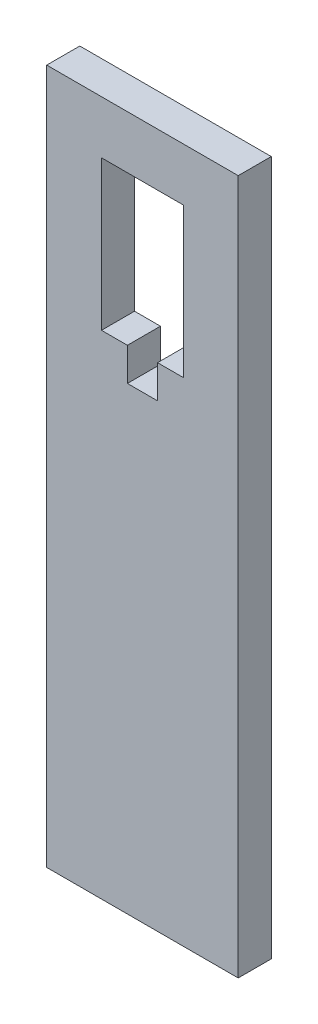
ISO-10303-21;
HEADER;
FILE_DESCRIPTION(('STEP AP214'),'2;1');
FILE_NAME('part.step','',(''),(''),'','','');
FILE_SCHEMA(('AUTOMOTIVE_DESIGN { 1 0 10303 214 1 1 1 1 }'));
ENDSEC;
DATA;
#1=APPLICATION_CONTEXT('core data for automotive mechanical design processes');
#2=APPLICATION_PROTOCOL_DEFINITION('international standard','automotive_design',2000,#1);
#3=PRODUCT_CONTEXT('',#1,'mechanical');
#4=PRODUCT('Part','Part','',(#3));
#5=PRODUCT_RELATED_PRODUCT_CATEGORY('part','',(#4));
#6=PRODUCT_DEFINITION_FORMATION('','',#4);
#7=PRODUCT_DEFINITION_CONTEXT('part definition',#1,'design');
#8=PRODUCT_DEFINITION('design','',#6,#7);
#9=PRODUCT_DEFINITION_SHAPE('','',#8);
#10=(LENGTH_UNIT() NAMED_UNIT(*) SI_UNIT(.MILLI.,.METRE.));
#11=(NAMED_UNIT(*) PLANE_ANGLE_UNIT() SI_UNIT($,.RADIAN.));
#12=(NAMED_UNIT(*) SI_UNIT($,.STERADIAN.) SOLID_ANGLE_UNIT());
#13=UNCERTAINTY_MEASURE_WITH_UNIT(LENGTH_MEASURE(1.E-05),#10,'distance_accuracy_value','');
#14=(GEOMETRIC_REPRESENTATION_CONTEXT(3) GLOBAL_UNCERTAINTY_ASSIGNED_CONTEXT((#13)) GLOBAL_UNIT_ASSIGNED_CONTEXT((#10,
#11,#12)) REPRESENTATION_CONTEXT('',''));
#15=CARTESIAN_POINT('',(0.,0.,0.));
#16=DIRECTION('',(0.,0.,1.));
#17=DIRECTION('',(1.,0.,0.));
#18=AXIS2_PLACEMENT_3D('',#15,#16,#17);
#19=CARTESIAN_POINT('',(-18.5582300884956,31.0897345132743,5.));
#20=DIRECTION('',(0.,-1.,0.));
#21=DIRECTION('',(0.,0.,-1.));
#22=AXIS2_PLACEMENT_3D('',#19,#20,#21);
#23=PLANE('',#22);
#24=DIRECTION('',(-1.,0.,0.));
#25=VECTOR('',#24,1.);
#26=CARTESIAN_POINT('',(-18.5582300884956,31.0897345132743,5.));
#27=LINE('',#26,#25);
#28=CARTESIAN_POINT('',(-6.35823008849556,31.0897345132743,5.));
#29=VERTEX_POINT('',#28);
#30=CARTESIAN_POINT('',(-10.2782300884956,31.0897345132743,5.));
#31=VERTEX_POINT('',#30);
#32=EDGE_CURVE('E241',#29,#31,#27,.T.);
#33=ORIENTED_EDGE('',*,*,#32,.F.);
#34=DIRECTION('',(0.,0.,1.));
#35=VECTOR('',#34,1.);
#36=CARTESIAN_POINT('',(-6.35823008849556,31.0897345132743,0.));
#37=LINE('',#36,#35);
#38=CARTESIAN_POINT('',(-6.35823008849556,31.0897345132743,0.));
#39=VERTEX_POINT('',#38);
#40=EDGE_CURVE('E136',#39,#29,#37,.T.);
#41=ORIENTED_EDGE('',*,*,#40,.F.);
#42=DIRECTION('',(-1.,0.,0.));
#43=VECTOR('',#42,1.);
#44=CARTESIAN_POINT('',(-18.5582300884956,31.0897345132743,0.));
#45=LINE('',#44,#43);
#46=CARTESIAN_POINT('',(-10.2782300884956,31.0897345132743,0.));
#47=VERTEX_POINT('',#46);
#48=EDGE_CURVE('E253',#39,#47,#45,.T.);
#49=ORIENTED_EDGE('',*,*,#48,.T.);
#50=DIRECTION('',(0.,0.,-1.));
#51=VECTOR('',#50,1.);
#52=CARTESIAN_POINT('',(-10.2782300884956,31.0897345132743,0.));
#53=LINE('',#52,#51);
#54=EDGE_CURVE('E213',#31,#47,#53,.T.);
#55=ORIENTED_EDGE('',*,*,#54,.F.);
#56=EDGE_LOOP('',(#33,#41,#49,#55));
#57=FACE_BOUND('',#56,.T.);
#58=ADVANCED_FACE('F39',(#57),#23,.F.);
#59=CARTESIAN_POINT('',(2.12176991150444,31.0897345132743,0.));
#60=VERTEX_POINT('',#59);
#61=CARTESIAN_POINT('',(-1.79823008849555,31.0897345132743,0.));
#62=VERTEX_POINT('',#61);
#63=EDGE_CURVE('E235',#60,#62,#45,.T.);
#64=ORIENTED_EDGE('',*,*,#63,.T.);
#65=DIRECTION('',(0.,0.,-1.));
#66=VECTOR('',#65,1.);
#67=CARTESIAN_POINT('',(-1.79823008849555,31.0897345132743,0.));
#68=LINE('',#67,#66);
#69=CARTESIAN_POINT('',(-1.79823008849555,31.0897345132743,5.));
#70=VERTEX_POINT('',#69);
#71=EDGE_CURVE('E150',#70,#62,#68,.T.);
#72=ORIENTED_EDGE('',*,*,#71,.F.);
#73=CARTESIAN_POINT('',(2.12176991150444,31.0897345132743,5.));
#74=VERTEX_POINT('',#73);
#75=EDGE_CURVE('E63',#74,#70,#27,.T.);
#76=ORIENTED_EDGE('',*,*,#75,.F.);
#77=DIRECTION('',(0.,0.,1.));
#78=VECTOR('',#77,1.);
#79=CARTESIAN_POINT('',(2.12176991150444,31.0897345132743,0.));
#80=LINE('',#79,#78);
#81=EDGE_CURVE('E192',#60,#74,#80,.T.);
#82=ORIENTED_EDGE('',*,*,#81,.F.);
#83=EDGE_LOOP('',(#64,#72,#76,#82));
#84=FACE_BOUND('',#83,.T.);
#85=ADVANCED_FACE('F281',(#84),#23,.F.);
#86=CARTESIAN_POINT('',(-18.5582300884956,31.0897345132743,5.));
#87=DIRECTION('',(1.,0.,0.));
#88=DIRECTION('',(0.,1.,0.));
#89=AXIS2_PLACEMENT_3D('',#86,#87,#88);
#90=PLANE('',#89);
#91=DIRECTION('',(0.,-1.,0.));
#92=VECTOR('',#91,1.);
#93=CARTESIAN_POINT('',(-18.5582300884956,31.0897345132743,0.));
#94=LINE('',#93,#92);
#95=CARTESIAN_POINT('',(-18.5582300884956,61.6897345132743,0.));
#96=VERTEX_POINT('',#95);
#97=CARTESIAN_POINT('',(-18.5582300884955,-43.4102654867257,0.));
#98=VERTEX_POINT('',#97);
#99=EDGE_CURVE('E229',#96,#98,#94,.T.);
#100=ORIENTED_EDGE('',*,*,#99,.T.);
#101=DIRECTION('',(0.,0.,-1.));
#102=VECTOR('',#101,1.);
#103=CARTESIAN_POINT('',(-18.5582300884955,-43.4102654867257,5.));
#104=LINE('',#103,#102);
#105=CARTESIAN_POINT('',(-18.5582300884955,-43.4102654867257,5.));
#106=VERTEX_POINT('',#105);
#107=EDGE_CURVE('E11',#106,#98,#104,.T.);
#108=ORIENTED_EDGE('',*,*,#107,.F.);
#109=DIRECTION('',(0.,-1.,0.));
#110=VECTOR('',#109,1.);
#111=CARTESIAN_POINT('',(-18.5582300884956,31.0897345132743,5.));
#112=LINE('',#111,#110);
#113=CARTESIAN_POINT('',(-18.5582300884956,61.6897345132743,5.));
#114=VERTEX_POINT('',#113);
#115=EDGE_CURVE('E230',#114,#106,#112,.T.);
#116=ORIENTED_EDGE('',*,*,#115,.F.);
#117=DIRECTION('',(0.,0.,1.));
#118=VECTOR('',#117,1.);
#119=CARTESIAN_POINT('',(-18.5582300884956,61.6897345132743,0.));
#120=LINE('',#119,#118);
#121=EDGE_CURVE('E175',#96,#114,#120,.T.);
#122=ORIENTED_EDGE('',*,*,#121,.F.);
#123=EDGE_LOOP('',(#100,#108,#116,#122));
#124=FACE_BOUND('',#123,.T.);
#125=ADVANCED_FACE('F41',(#124),#90,.F.);
#126=CARTESIAN_POINT('',(-18.5582300884955,-43.4102654867257,5.));
#127=DIRECTION('',(0.,1.,0.));
#128=DIRECTION('',(0.,0.,1.));
#129=AXIS2_PLACEMENT_3D('',#126,#127,#128);
#130=PLANE('',#129);
#131=DIRECTION('',(1.,0.,0.));
#132=VECTOR('',#131,1.);
#133=CARTESIAN_POINT('',(-18.5582300884955,-43.4102654867257,0.));
#134=LINE('',#133,#132);
#135=CARTESIAN_POINT('',(10.4017699115045,-43.4102654867257,0.));
#136=VERTEX_POINT('',#135);
#137=EDGE_CURVE('E247',#98,#136,#134,.T.);
#138=ORIENTED_EDGE('',*,*,#137,.T.);
#139=DIRECTION('',(0.,0.,-1.));
#140=VECTOR('',#139,1.);
#141=CARTESIAN_POINT('',(10.4017699115045,-43.4102654867257,5.));
#142=LINE('',#141,#140);
#143=CARTESIAN_POINT('',(10.4017699115045,-43.4102654867257,5.));
#144=VERTEX_POINT('',#143);
#145=EDGE_CURVE('E48',#144,#136,#142,.T.);
#146=ORIENTED_EDGE('',*,*,#145,.F.);
#147=DIRECTION('',(1.,0.,0.));
#148=VECTOR('',#147,1.);
#149=CARTESIAN_POINT('',(-18.5582300884955,-43.4102654867257,5.));
#150=LINE('',#149,#148);
#151=EDGE_CURVE('E234',#106,#144,#150,.T.);
#152=ORIENTED_EDGE('',*,*,#151,.F.);
#153=ORIENTED_EDGE('',*,*,#107,.T.);
#154=EDGE_LOOP('',(#138,#146,#152,#153));
#155=FACE_BOUND('',#154,.T.);
#156=ADVANCED_FACE('F274',(#155),#130,.F.);
#157=CARTESIAN_POINT('',(10.4017699115044,31.0897345132743,5.));
#158=DIRECTION('',(-1.,0.,0.));
#159=DIRECTION('',(0.,-1.,0.));
#160=AXIS2_PLACEMENT_3D('',#157,#158,#159);
#161=PLANE('',#160);
#162=DIRECTION('',(0.,1.,0.));
#163=VECTOR('',#162,1.);
#164=CARTESIAN_POINT('',(10.4017699115044,31.0897345132743,0.));
#165=LINE('',#164,#163);
#166=CARTESIAN_POINT('',(10.4017699115044,61.6897345132743,0.));
#167=VERTEX_POINT('',#166);
#168=EDGE_CURVE('E250',#136,#167,#165,.T.);
#169=ORIENTED_EDGE('',*,*,#168,.T.);
#170=DIRECTION('',(0.,0.,-1.));
#171=VECTOR('',#170,1.);
#172=CARTESIAN_POINT('',(10.4017699115044,61.6897345132743,0.));
#173=LINE('',#172,#171);
#174=CARTESIAN_POINT('',(10.4017699115044,61.6897345132743,5.));
#175=VERTEX_POINT('',#174);
#176=EDGE_CURVE('E184',#175,#167,#173,.T.);
#177=ORIENTED_EDGE('',*,*,#176,.F.);
#178=DIRECTION('',(0.,1.,0.));
#179=VECTOR('',#178,1.);
#180=CARTESIAN_POINT('',(10.4017699115044,31.0897345132743,5.));
#181=LINE('',#180,#179);
#182=EDGE_CURVE('E238',#144,#175,#181,.T.);
#183=ORIENTED_EDGE('',*,*,#182,.F.);
#184=ORIENTED_EDGE('',*,*,#145,.T.);
#185=EDGE_LOOP('',(#169,#177,#183,#184));
#186=FACE_BOUND('',#185,.T.);
#187=ADVANCED_FACE('F262',(#186),#161,.F.);
#188=CARTESIAN_POINT('',(0.,0.,5.));
#189=DIRECTION('',(0.,0.,1.));
#190=DIRECTION('',(1.,0.,0.));
#191=AXIS2_PLACEMENT_3D('',#188,#189,#190);
#192=PLANE('',#191);
#193=DIRECTION('',(0.,1.,0.));
#194=VECTOR('',#193,1.);
#195=CARTESIAN_POINT('',(-6.35823008849556,26.0897345132743,5.));
#196=LINE('',#195,#194);
#197=CARTESIAN_POINT('',(-6.35823008849556,26.0897345132743,5.));
#198=VERTEX_POINT('',#197);
#199=EDGE_CURVE('E131',#198,#29,#196,.T.);
#200=ORIENTED_EDGE('',*,*,#199,.T.);
#201=ORIENTED_EDGE('',*,*,#32,.T.);
#202=DIRECTION('',(0.,-1.,0.));
#203=VECTOR('',#202,1.);
#204=CARTESIAN_POINT('',(-10.2782300884956,53.6897345132743,5.));
#205=LINE('',#204,#203);
#206=CARTESIAN_POINT('',(-10.2782300884956,53.6897345132743,5.));
#207=VERTEX_POINT('',#206);
#208=EDGE_CURVE('E225',#207,#31,#205,.T.);
#209=ORIENTED_EDGE('',*,*,#208,.F.);
#210=DIRECTION('',(1.,0.,0.));
#211=VECTOR('',#210,1.);
#212=CARTESIAN_POINT('',(-18.5582300884956,53.6897345132743,5.));
#213=LINE('',#212,#211);
#214=CARTESIAN_POINT('',(2.12176991150444,53.6897345132743,5.));
#215=VERTEX_POINT('',#214);
#216=EDGE_CURVE('E168',#207,#215,#213,.T.);
#217=ORIENTED_EDGE('',*,*,#216,.T.);
#218=DIRECTION('',(0.,-1.,0.));
#219=VECTOR('',#218,1.);
#220=CARTESIAN_POINT('',(2.12176991150444,53.6897345132743,5.));
#221=LINE('',#220,#219);
#222=EDGE_CURVE('E203',#215,#74,#221,.T.);
#223=ORIENTED_EDGE('',*,*,#222,.T.);
#224=ORIENTED_EDGE('',*,*,#75,.T.);
#225=DIRECTION('',(0.,1.,0.));
#226=VECTOR('',#225,1.);
#227=CARTESIAN_POINT('',(-1.79823008849555,26.0897345132743,5.));
#228=LINE('',#227,#226);
#229=CARTESIAN_POINT('',(-1.79823008849555,26.0897345132743,5.));
#230=VERTEX_POINT('',#229);
#231=EDGE_CURVE('E141',#230,#70,#228,.T.);
#232=ORIENTED_EDGE('',*,*,#231,.F.);
#233=DIRECTION('',(1.,0.,0.));
#234=VECTOR('',#233,1.);
#235=CARTESIAN_POINT('',(-6.35823008849556,26.0897345132743,5.));
#236=LINE('',#235,#234);
#237=EDGE_CURVE('E145',#198,#230,#236,.T.);
#238=ORIENTED_EDGE('',*,*,#237,.F.);
#239=EDGE_LOOP('',(#200,#201,#209,#217,#223,#224,#232,#238));
#240=FACE_BOUND('',#239,.T.);
#241=ORIENTED_EDGE('',*,*,#115,.T.);
#242=ORIENTED_EDGE('',*,*,#151,.T.);
#243=ORIENTED_EDGE('',*,*,#182,.T.);
#244=DIRECTION('',(1.,0.,0.));
#245=VECTOR('',#244,1.);
#246=CARTESIAN_POINT('',(-18.5582300884956,61.6897345132743,5.));
#247=LINE('',#246,#245);
#248=EDGE_CURVE('E179',#114,#175,#247,.T.);
#249=ORIENTED_EDGE('',*,*,#248,.F.);
#250=EDGE_LOOP('',(#241,#242,#243,#249));
#251=FACE_BOUND('',#250,.T.);
#252=ADVANCED_FACE('F152',(#240,#251),#192,.T.);
#253=CARTESIAN_POINT('',(0.,0.,0.));
#254=DIRECTION('',(0.,0.,1.));
#255=DIRECTION('',(1.,0.,0.));
#256=AXIS2_PLACEMENT_3D('',#253,#254,#255);
#257=PLANE('',#256);
#258=ORIENTED_EDGE('',*,*,#48,.F.);
#259=DIRECTION('',(0.,1.,0.));
#260=VECTOR('',#259,1.);
#261=CARTESIAN_POINT('',(-6.35823008849556,26.0897345132743,0.));
#262=LINE('',#261,#260);
#263=CARTESIAN_POINT('',(-6.35823008849556,26.0897345132743,0.));
#264=VERTEX_POINT('',#263);
#265=EDGE_CURVE('E165',#264,#39,#262,.T.);
#266=ORIENTED_EDGE('',*,*,#265,.F.);
#267=DIRECTION('',(-1.,0.,0.));
#268=VECTOR('',#267,1.);
#269=CARTESIAN_POINT('',(-6.35823008849556,26.0897345132743,0.));
#270=LINE('',#269,#268);
#271=CARTESIAN_POINT('',(-1.79823008849555,26.0897345132743,0.));
#272=VERTEX_POINT('',#271);
#273=EDGE_CURVE('E142',#272,#264,#270,.T.);
#274=ORIENTED_EDGE('',*,*,#273,.F.);
#275=DIRECTION('',(0.,1.,0.));
#276=VECTOR('',#275,1.);
#277=CARTESIAN_POINT('',(-1.79823008849555,26.0897345132743,0.));
#278=LINE('',#277,#276);
#279=EDGE_CURVE('E169',#272,#62,#278,.T.);
#280=ORIENTED_EDGE('',*,*,#279,.T.);
#281=ORIENTED_EDGE('',*,*,#63,.F.);
#282=DIRECTION('',(0.,-1.,0.));
#283=VECTOR('',#282,1.);
#284=CARTESIAN_POINT('',(2.12176991150444,53.6897345132743,0.));
#285=LINE('',#284,#283);
#286=CARTESIAN_POINT('',(2.12176991150444,53.6897345132743,0.));
#287=VERTEX_POINT('',#286);
#288=EDGE_CURVE('E209',#287,#60,#285,.T.);
#289=ORIENTED_EDGE('',*,*,#288,.F.);
#290=DIRECTION('',(-1.,0.,0.));
#291=VECTOR('',#290,1.);
#292=CARTESIAN_POINT('',(-18.5582300884956,53.6897345132743,0.));
#293=LINE('',#292,#291);
#294=CARTESIAN_POINT('',(-10.2782300884956,53.6897345132743,0.));
#295=VERTEX_POINT('',#294);
#296=EDGE_CURVE('E180',#287,#295,#293,.T.);
#297=ORIENTED_EDGE('',*,*,#296,.T.);
#298=DIRECTION('',(0.,-1.,0.));
#299=VECTOR('',#298,1.);
#300=CARTESIAN_POINT('',(-10.2782300884956,53.6897345132743,0.));
#301=LINE('',#300,#299);
#302=EDGE_CURVE('E218',#295,#47,#301,.T.);
#303=ORIENTED_EDGE('',*,*,#302,.T.);
#304=EDGE_LOOP('',(#258,#266,#274,#280,#281,#289,#297,#303));
#305=FACE_BOUND('',#304,.T.);
#306=ORIENTED_EDGE('',*,*,#99,.F.);
#307=DIRECTION('',(-1.,0.,0.));
#308=VECTOR('',#307,1.);
#309=CARTESIAN_POINT('',(-18.5582300884956,61.6897345132743,0.));
#310=LINE('',#309,#308);
#311=EDGE_CURVE('E188',#167,#96,#310,.T.);
#312=ORIENTED_EDGE('',*,*,#311,.F.);
#313=ORIENTED_EDGE('',*,*,#168,.F.);
#314=ORIENTED_EDGE('',*,*,#137,.F.);
#315=EDGE_LOOP('',(#306,#312,#313,#314));
#316=FACE_BOUND('',#315,.T.);
#317=ADVANCED_FACE('F267',(#305,#316),#257,.F.);
#318=CARTESIAN_POINT('',(-10.2782300884956,53.6897345132743,0.));
#319=DIRECTION('',(-1.,0.,0.));
#320=DIRECTION('',(0.,0.,1.));
#321=AXIS2_PLACEMENT_3D('',#318,#319,#320);
#322=PLANE('',#321);
#323=ORIENTED_EDGE('',*,*,#54,.T.);
#324=ORIENTED_EDGE('',*,*,#302,.F.);
#325=DIRECTION('',(0.,0.,-1.));
#326=VECTOR('',#325,1.);
#327=CARTESIAN_POINT('',(-10.2782300884956,53.6897345132743,0.));
#328=LINE('',#327,#326);
#329=EDGE_CURVE('E214',#207,#295,#328,.T.);
#330=ORIENTED_EDGE('',*,*,#329,.F.);
#331=ORIENTED_EDGE('',*,*,#208,.T.);
#332=EDGE_LOOP('',(#323,#324,#330,#331));
#333=FACE_BOUND('',#332,.T.);
#334=ADVANCED_FACE('F291',(#333),#322,.F.);
#335=CARTESIAN_POINT('',(2.12176991150444,53.6897345132743,0.));
#336=DIRECTION('',(1.,0.,0.));
#337=DIRECTION('',(0.,0.,-1.));
#338=AXIS2_PLACEMENT_3D('',#335,#336,#337);
#339=PLANE('',#338);
#340=ORIENTED_EDGE('',*,*,#81,.T.);
#341=ORIENTED_EDGE('',*,*,#222,.F.);
#342=DIRECTION('',(0.,0.,1.));
#343=VECTOR('',#342,1.);
#344=CARTESIAN_POINT('',(2.12176991150444,53.6897345132743,0.));
#345=LINE('',#344,#343);
#346=EDGE_CURVE('E199',#287,#215,#345,.T.);
#347=ORIENTED_EDGE('',*,*,#346,.F.);
#348=ORIENTED_EDGE('',*,*,#288,.T.);
#349=EDGE_LOOP('',(#340,#341,#347,#348));
#350=FACE_BOUND('',#349,.T.);
#351=ADVANCED_FACE('F297',(#350),#339,.F.);
#352=CARTESIAN_POINT('',(0.,53.6897345132743,0.));
#353=DIRECTION('',(0.,1.,0.));
#354=DIRECTION('',(0.,0.,1.));
#355=AXIS2_PLACEMENT_3D('',#352,#353,#354);
#356=PLANE('',#355);
#357=ORIENTED_EDGE('',*,*,#216,.F.);
#358=ORIENTED_EDGE('',*,*,#329,.T.);
#359=ORIENTED_EDGE('',*,*,#296,.F.);
#360=ORIENTED_EDGE('',*,*,#346,.T.);
#361=EDGE_LOOP('',(#357,#358,#359,#360));
#362=FACE_BOUND('',#361,.T.);
#363=ADVANCED_FACE('F301',(#362),#356,.F.);
#364=CARTESIAN_POINT('',(0.,61.6897345132743,0.));
#365=DIRECTION('',(0.,1.,0.));
#366=DIRECTION('',(0.,0.,1.));
#367=AXIS2_PLACEMENT_3D('',#364,#365,#366);
#368=PLANE('',#367);
#369=ORIENTED_EDGE('',*,*,#121,.T.);
#370=ORIENTED_EDGE('',*,*,#248,.T.);
#371=ORIENTED_EDGE('',*,*,#176,.T.);
#372=ORIENTED_EDGE('',*,*,#311,.T.);
#373=EDGE_LOOP('',(#369,#370,#371,#372));
#374=FACE_BOUND('',#373,.T.);
#375=ADVANCED_FACE('F270',(#374),#368,.T.);
#376=CARTESIAN_POINT('',(-6.35823008849556,26.0897345132743,0.));
#377=DIRECTION('',(-1.,0.,0.));
#378=DIRECTION('',(0.,0.,1.));
#379=AXIS2_PLACEMENT_3D('',#376,#377,#378);
#380=PLANE('',#379);
#381=ORIENTED_EDGE('',*,*,#40,.T.);
#382=ORIENTED_EDGE('',*,*,#199,.F.);
#383=DIRECTION('',(0.,0.,1.));
#384=VECTOR('',#383,1.);
#385=CARTESIAN_POINT('',(-6.35823008849556,26.0897345132743,0.));
#386=LINE('',#385,#384);
#387=EDGE_CURVE('E134',#264,#198,#386,.T.);
#388=ORIENTED_EDGE('',*,*,#387,.F.);
#389=ORIENTED_EDGE('',*,*,#265,.T.);
#390=EDGE_LOOP('',(#381,#382,#388,#389));
#391=FACE_BOUND('',#390,.T.);
#392=ADVANCED_FACE('F133',(#391),#380,.F.);
#393=CARTESIAN_POINT('',(-1.79823008849555,26.0897345132743,0.));
#394=DIRECTION('',(1.,0.,0.));
#395=DIRECTION('',(0.,0.,-1.));
#396=AXIS2_PLACEMENT_3D('',#393,#394,#395);
#397=PLANE('',#396);
#398=ORIENTED_EDGE('',*,*,#71,.T.);
#399=ORIENTED_EDGE('',*,*,#279,.F.);
#400=DIRECTION('',(0.,0.,-1.));
#401=VECTOR('',#400,1.);
#402=CARTESIAN_POINT('',(-1.79823008849555,26.0897345132743,0.));
#403=LINE('',#402,#401);
#404=EDGE_CURVE('E55',#230,#272,#403,.T.);
#405=ORIENTED_EDGE('',*,*,#404,.F.);
#406=ORIENTED_EDGE('',*,*,#231,.T.);
#407=EDGE_LOOP('',(#398,#399,#405,#406));
#408=FACE_BOUND('',#407,.T.);
#409=ADVANCED_FACE('F310',(#408),#397,.F.);
#410=CARTESIAN_POINT('',(0.,26.0897345132743,0.));
#411=DIRECTION('',(0.,1.,0.));
#412=DIRECTION('',(0.,0.,1.));
#413=AXIS2_PLACEMENT_3D('',#410,#411,#412);
#414=PLANE('',#413);
#415=ORIENTED_EDGE('',*,*,#387,.T.);
#416=ORIENTED_EDGE('',*,*,#237,.T.);
#417=ORIENTED_EDGE('',*,*,#404,.T.);
#418=ORIENTED_EDGE('',*,*,#273,.T.);
#419=EDGE_LOOP('',(#415,#416,#417,#418));
#420=FACE_BOUND('',#419,.T.);
#421=ADVANCED_FACE('F144',(#420),#414,.T.);
#422=CLOSED_SHELL('',(#58,#85,#125,#156,#187,#252,#317,#334,#351,#363,#375,#392,#409,#421));
#423=MANIFOLD_SOLID_BREP('B2',#422);
#424=ADVANCED_BREP_SHAPE_REPRESENTATION('',(#18,#423),#14);
#425=SHAPE_DEFINITION_REPRESENTATION(#9,#424);
ENDSEC;
END-ISO-10303-21;
